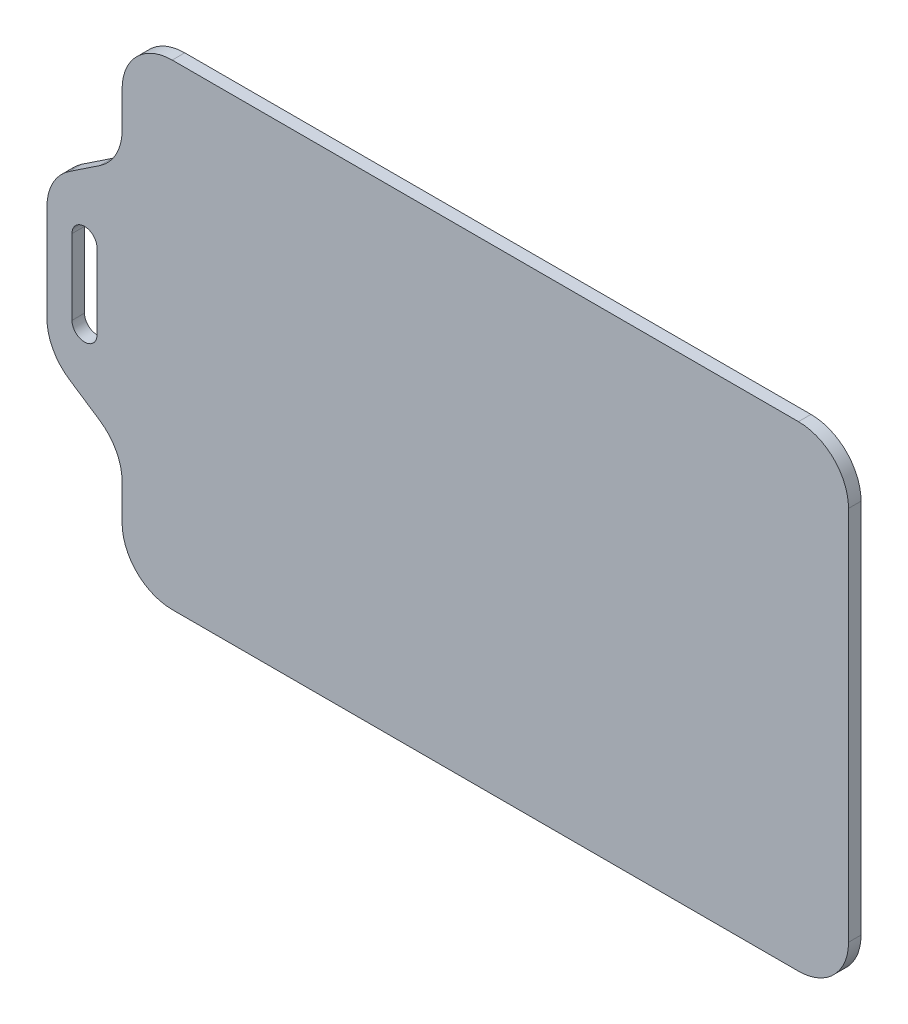
ISO-10303-21;
HEADER;
FILE_DESCRIPTION(('STEP AP214'),'2;1');
FILE_NAME('part.step','',(''),(''),'','','');
FILE_SCHEMA(('AUTOMOTIVE_DESIGN { 1 0 10303 214 1 1 1 1 }'));
ENDSEC;
DATA;
#1=APPLICATION_CONTEXT('core data for automotive mechanical design processes');
#2=APPLICATION_PROTOCOL_DEFINITION('international standard','automotive_design',2000,#1);
#3=PRODUCT_CONTEXT('',#1,'mechanical');
#4=PRODUCT('Part','Part','',(#3));
#5=PRODUCT_RELATED_PRODUCT_CATEGORY('part','',(#4));
#6=PRODUCT_DEFINITION_FORMATION('','',#4);
#7=PRODUCT_DEFINITION_CONTEXT('part definition',#1,'design');
#8=PRODUCT_DEFINITION('design','',#6,#7);
#9=PRODUCT_DEFINITION_SHAPE('','',#8);
#10=(LENGTH_UNIT() NAMED_UNIT(*) SI_UNIT(.MILLI.,.METRE.));
#11=(NAMED_UNIT(*) PLANE_ANGLE_UNIT() SI_UNIT($,.RADIAN.));
#12=(NAMED_UNIT(*) SI_UNIT($,.STERADIAN.) SOLID_ANGLE_UNIT());
#13=UNCERTAINTY_MEASURE_WITH_UNIT(LENGTH_MEASURE(1.E-05),#10,'distance_accuracy_value','');
#14=(GEOMETRIC_REPRESENTATION_CONTEXT(3) GLOBAL_UNCERTAINTY_ASSIGNED_CONTEXT((#13)) GLOBAL_UNIT_ASSIGNED_CONTEXT((#10,
#11,#12)) REPRESENTATION_CONTEXT('',''));
#15=CARTESIAN_POINT('',(0.,0.,0.));
#16=DIRECTION('',(0.,0.,1.));
#17=DIRECTION('',(1.,0.,0.));
#18=AXIS2_PLACEMENT_3D('',#15,#16,#17);
#19=CARTESIAN_POINT('',(-46.0375,4.19649336631483,1.5875));
#20=DIRECTION('',(1.,0.,0.));
#21=DIRECTION('',(0.,1.,0.));
#22=AXIS2_PLACEMENT_3D('',#19,#20,#21);
#23=PLANE('',#22);
#24=DIRECTION('',(0.,-1.,0.));
#25=VECTOR('',#24,1.);
#26=CARTESIAN_POINT('',(-46.0375,4.19649336631483,0.));
#27=LINE('',#26,#25);
#28=CARTESIAN_POINT('',(-46.0375,23.8125,0.));
#29=VERTEX_POINT('',#28);
#30=CARTESIAN_POINT('',(-46.0375,19.2734168663988,0.));
#31=VERTEX_POINT('',#30);
#32=EDGE_CURVE('E283',#29,#31,#27,.T.);
#33=ORIENTED_EDGE('',*,*,#32,.T.);
#34=DIRECTION('',(0.,0.,1.));
#35=VECTOR('',#34,1.);
#36=CARTESIAN_POINT('',(-46.0375,19.2734168663988,1.5875));
#37=LINE('',#36,#35);
#38=CARTESIAN_POINT('',(-46.0375,19.2734168663988,1.5875));
#39=VERTEX_POINT('',#38);
#40=EDGE_CURVE('E397',#31,#39,#37,.T.);
#41=ORIENTED_EDGE('',*,*,#40,.T.);
#42=DIRECTION('',(0.,-1.,0.));
#43=VECTOR('',#42,1.);
#44=CARTESIAN_POINT('',(-46.0375,4.19649336631483,1.5875));
#45=LINE('',#44,#43);
#46=CARTESIAN_POINT('',(-46.0375,23.8125,1.5875));
#47=VERTEX_POINT('',#46);
#48=EDGE_CURVE('E304',#47,#39,#45,.T.);
#49=ORIENTED_EDGE('',*,*,#48,.F.);
#50=DIRECTION('',(0.,0.,-1.));
#51=VECTOR('',#50,1.);
#52=CARTESIAN_POINT('',(-46.0375,23.8125,1.5875));
#53=LINE('',#52,#51);
#54=EDGE_CURVE('E340',#47,#29,#53,.T.);
#55=ORIENTED_EDGE('',*,*,#54,.T.);
#56=EDGE_LOOP('',(#33,#41,#49,#55));
#57=FACE_BOUND('',#56,.T.);
#58=ADVANCED_FACE('F16',(#57),#23,.F.);
#59=CARTESIAN_POINT('',(-46.0375,-19.2734168663988,1.5875));
#60=VERTEX_POINT('',#59);
#61=CARTESIAN_POINT('',(-46.0375,-23.8125,1.5875));
#62=VERTEX_POINT('',#61);
#63=EDGE_CURVE('E303',#60,#62,#45,.T.);
#64=ORIENTED_EDGE('',*,*,#63,.F.);
#65=DIRECTION('',(0.,0.,1.));
#66=VECTOR('',#65,1.);
#67=CARTESIAN_POINT('',(-46.0375,-19.2734168663988,0.));
#68=LINE('',#67,#66);
#69=CARTESIAN_POINT('',(-46.0375,-19.2734168663988,0.));
#70=VERTEX_POINT('',#69);
#71=EDGE_CURVE('E401',#60,#70,#68,.F.);
#72=ORIENTED_EDGE('',*,*,#71,.T.);
#73=CARTESIAN_POINT('',(-46.0375,-23.8125,0.));
#74=VERTEX_POINT('',#73);
#75=EDGE_CURVE('E334',#70,#74,#27,.T.);
#76=ORIENTED_EDGE('',*,*,#75,.T.);
#77=DIRECTION('',(0.,0.,-1.));
#78=VECTOR('',#77,1.);
#79=CARTESIAN_POINT('',(-46.0375,-23.8125,1.5875));
#80=LINE('',#79,#78);
#81=EDGE_CURVE('E308',#62,#74,#80,.T.);
#82=ORIENTED_EDGE('',*,*,#81,.F.);
#83=EDGE_LOOP('',(#64,#72,#76,#82));
#84=FACE_BOUND('',#83,.T.);
#85=ADVANCED_FACE('F419',(#84),#23,.F.);
#86=CARTESIAN_POINT('',(-39.6875,-23.8125,1.5875));
#87=DIRECTION('',(0.,0.,-1.));
#88=DIRECTION('',(-1.,0.,0.));
#89=AXIS2_PLACEMENT_3D('',#86,#87,#88);
#90=CYLINDRICAL_SURFACE('',#89,6.35);
#91=CARTESIAN_POINT('',(-39.6875,-23.8125,0.));
#92=DIRECTION('',(0.,0.,1.));
#93=DIRECTION('',(-1.,0.,0.));
#94=AXIS2_PLACEMENT_3D('',#91,#92,#93);
#95=CIRCLE('',#94,6.35);
#96=CARTESIAN_POINT('',(-39.6875,-30.1625,0.));
#97=VERTEX_POINT('',#96);
#98=EDGE_CURVE('E270',#74,#97,#95,.T.);
#99=ORIENTED_EDGE('',*,*,#98,.T.);
#100=DIRECTION('',(0.,0.,-1.));
#101=VECTOR('',#100,1.);
#102=CARTESIAN_POINT('',(-39.6875,-30.1625,1.5875));
#103=LINE('',#102,#101);
#104=CARTESIAN_POINT('',(-39.6875,-30.1625,1.5875));
#105=VERTEX_POINT('',#104);
#106=EDGE_CURVE('E360',#105,#97,#103,.T.);
#107=ORIENTED_EDGE('',*,*,#106,.F.);
#108=CARTESIAN_POINT('',(-39.6875,-23.8125,1.5875));
#109=DIRECTION('',(0.,0.,1.));
#110=DIRECTION('',(-1.,0.,0.));
#111=AXIS2_PLACEMENT_3D('',#108,#109,#110);
#112=CIRCLE('',#111,6.35);
#113=EDGE_CURVE('E278',#62,#105,#112,.T.);
#114=ORIENTED_EDGE('',*,*,#113,.F.);
#115=ORIENTED_EDGE('',*,*,#81,.T.);
#116=EDGE_LOOP('',(#99,#107,#114,#115));
#117=FACE_BOUND('',#116,.T.);
#118=ADVANCED_FACE('F477',(#117),#90,.T.);
#119=CARTESIAN_POINT('',(-0.0371188492481823,-30.1625,1.5875));
#120=DIRECTION('',(0.,1.,0.));
#121=DIRECTION('',(-1.,0.,0.));
#122=AXIS2_PLACEMENT_3D('',#119,#120,#121);
#123=PLANE('',#122);
#124=DIRECTION('',(1.,0.,0.));
#125=VECTOR('',#124,1.);
#126=CARTESIAN_POINT('',(-0.0371188492481823,-30.1625,0.));
#127=LINE('',#126,#125);
#128=CARTESIAN_POINT('',(39.6875,-30.1625,0.));
#129=VERTEX_POINT('',#128);
#130=EDGE_CURVE('E312',#97,#129,#127,.T.);
#131=ORIENTED_EDGE('',*,*,#130,.T.);
#132=DIRECTION('',(0.,0.,-1.));
#133=VECTOR('',#132,1.);
#134=CARTESIAN_POINT('',(39.6875,-30.1625,1.5875));
#135=LINE('',#134,#133);
#136=CARTESIAN_POINT('',(39.6875,-30.1625,1.5875));
#137=VERTEX_POINT('',#136);
#138=EDGE_CURVE('E356',#137,#129,#135,.T.);
#139=ORIENTED_EDGE('',*,*,#138,.F.);
#140=DIRECTION('',(1.,0.,0.));
#141=VECTOR('',#140,1.);
#142=CARTESIAN_POINT('',(-0.0371188492481823,-30.1625,1.5875));
#143=LINE('',#142,#141);
#144=EDGE_CURVE('E282',#105,#137,#143,.T.);
#145=ORIENTED_EDGE('',*,*,#144,.F.);
#146=ORIENTED_EDGE('',*,*,#106,.T.);
#147=EDGE_LOOP('',(#131,#139,#145,#146));
#148=FACE_BOUND('',#147,.T.);
#149=ADVANCED_FACE('F475',(#148),#123,.F.);
#150=CARTESIAN_POINT('',(39.6875,-23.8125,1.5875));
#151=DIRECTION('',(0.,0.,-1.));
#152=DIRECTION('',(-1.,0.,0.));
#153=AXIS2_PLACEMENT_3D('',#150,#151,#152);
#154=CYLINDRICAL_SURFACE('',#153,6.35);
#155=CARTESIAN_POINT('',(39.6875,-23.8125,0.));
#156=DIRECTION('',(0.,0.,1.));
#157=DIRECTION('',(0.,-1.,0.));
#158=AXIS2_PLACEMENT_3D('',#155,#156,#157);
#159=CIRCLE('',#158,6.35);
#160=CARTESIAN_POINT('',(46.0375,-23.8125,0.));
#161=VERTEX_POINT('',#160);
#162=EDGE_CURVE('E315',#129,#161,#159,.T.);
#163=ORIENTED_EDGE('',*,*,#162,.T.);
#164=DIRECTION('',(0.,0.,-1.));
#165=VECTOR('',#164,1.);
#166=CARTESIAN_POINT('',(46.0375,-23.8125,1.5875));
#167=LINE('',#166,#165);
#168=CARTESIAN_POINT('',(46.0375,-23.8125,1.5875));
#169=VERTEX_POINT('',#168);
#170=EDGE_CURVE('E353',#169,#161,#167,.T.);
#171=ORIENTED_EDGE('',*,*,#170,.F.);
#172=CARTESIAN_POINT('',(39.6875,-23.8125,1.5875));
#173=DIRECTION('',(0.,0.,1.));
#174=DIRECTION('',(0.,-1.,0.));
#175=AXIS2_PLACEMENT_3D('',#172,#173,#174);
#176=CIRCLE('',#175,6.35);
#177=EDGE_CURVE('E286',#137,#169,#176,.T.);
#178=ORIENTED_EDGE('',*,*,#177,.F.);
#179=ORIENTED_EDGE('',*,*,#138,.T.);
#180=EDGE_LOOP('',(#163,#171,#178,#179));
#181=FACE_BOUND('',#180,.T.);
#182=ADVANCED_FACE('F470',(#181),#154,.T.);
#183=CARTESIAN_POINT('',(46.0375,-16.3101635963253,1.5875));
#184=DIRECTION('',(1.,0.,0.));
#185=DIRECTION('',(0.,1.,0.));
#186=AXIS2_PLACEMENT_3D('',#183,#184,#185);
#187=PLANE('',#186);
#188=DIRECTION('',(0.,-1.,0.));
#189=VECTOR('',#188,1.);
#190=CARTESIAN_POINT('',(46.0375,-16.3101635963253,0.));
#191=LINE('',#190,#189);
#192=CARTESIAN_POINT('',(46.0375,23.8125,0.));
#193=VERTEX_POINT('',#192);
#194=EDGE_CURVE('E319',#193,#161,#191,.T.);
#195=ORIENTED_EDGE('',*,*,#194,.F.);
#196=DIRECTION('',(0.,0.,-1.));
#197=VECTOR('',#196,1.);
#198=CARTESIAN_POINT('',(46.0375,23.8125,1.5875));
#199=LINE('',#198,#197);
#200=CARTESIAN_POINT('',(46.0375,23.8125,1.5875));
#201=VERTEX_POINT('',#200);
#202=EDGE_CURVE('E350',#201,#193,#199,.T.);
#203=ORIENTED_EDGE('',*,*,#202,.F.);
#204=DIRECTION('',(0.,-1.,0.));
#205=VECTOR('',#204,1.);
#206=CARTESIAN_POINT('',(46.0375,-16.3101635963253,1.5875));
#207=LINE('',#206,#205);
#208=EDGE_CURVE('E289',#201,#169,#207,.T.);
#209=ORIENTED_EDGE('',*,*,#208,.T.);
#210=ORIENTED_EDGE('',*,*,#170,.T.);
#211=EDGE_LOOP('',(#195,#203,#209,#210));
#212=FACE_BOUND('',#211,.T.);
#213=ADVANCED_FACE('F465',(#212),#187,.T.);
#214=CARTESIAN_POINT('',(39.6875,23.8125,1.5875));
#215=DIRECTION('',(0.,0.,-1.));
#216=DIRECTION('',(-1.,0.,0.));
#217=AXIS2_PLACEMENT_3D('',#214,#215,#216);
#218=CYLINDRICAL_SURFACE('',#217,6.35);
#219=CARTESIAN_POINT('',(39.6875,23.8125,0.));
#220=DIRECTION('',(0.,0.,1.));
#221=DIRECTION('',(1.,0.,0.));
#222=AXIS2_PLACEMENT_3D('',#219,#220,#221);
#223=CIRCLE('',#222,6.35);
#224=CARTESIAN_POINT('',(39.6875,30.1625,0.));
#225=VERTEX_POINT('',#224);
#226=EDGE_CURVE('E323',#193,#225,#223,.T.);
#227=ORIENTED_EDGE('',*,*,#226,.T.);
#228=DIRECTION('',(0.,0.,-1.));
#229=VECTOR('',#228,1.);
#230=CARTESIAN_POINT('',(39.6875,30.1625,1.5875));
#231=LINE('',#230,#229);
#232=CARTESIAN_POINT('',(39.6875,30.1625,1.5875));
#233=VERTEX_POINT('',#232);
#234=EDGE_CURVE('E347',#233,#225,#231,.T.);
#235=ORIENTED_EDGE('',*,*,#234,.F.);
#236=CARTESIAN_POINT('',(39.6875,23.8125,1.5875));
#237=DIRECTION('',(0.,0.,1.));
#238=DIRECTION('',(1.,0.,0.));
#239=AXIS2_PLACEMENT_3D('',#236,#237,#238);
#240=CIRCLE('',#239,6.35);
#241=EDGE_CURVE('E293',#201,#233,#240,.T.);
#242=ORIENTED_EDGE('',*,*,#241,.F.);
#243=ORIENTED_EDGE('',*,*,#202,.T.);
#244=EDGE_LOOP('',(#227,#235,#242,#243));
#245=FACE_BOUND('',#244,.T.);
#246=ADVANCED_FACE('F461',(#245),#218,.T.);
#247=CARTESIAN_POINT('',(0.,30.1625,1.5875));
#248=DIRECTION('',(0.,1.,0.));
#249=DIRECTION('',(-1.,0.,0.));
#250=AXIS2_PLACEMENT_3D('',#247,#248,#249);
#251=PLANE('',#250);
#252=DIRECTION('',(1.,0.,0.));
#253=VECTOR('',#252,1.);
#254=CARTESIAN_POINT('',(0.,30.1625,0.));
#255=LINE('',#254,#253);
#256=CARTESIAN_POINT('',(-39.6875,30.1625,0.));
#257=VERTEX_POINT('',#256);
#258=EDGE_CURVE('E327',#257,#225,#255,.T.);
#259=ORIENTED_EDGE('',*,*,#258,.F.);
#260=DIRECTION('',(0.,0.,-1.));
#261=VECTOR('',#260,1.);
#262=CARTESIAN_POINT('',(-39.6875,30.1625,1.5875));
#263=LINE('',#262,#261);
#264=CARTESIAN_POINT('',(-39.6875,30.1625,1.5875));
#265=VERTEX_POINT('',#264);
#266=EDGE_CURVE('E344',#265,#257,#263,.T.);
#267=ORIENTED_EDGE('',*,*,#266,.F.);
#268=DIRECTION('',(1.,0.,0.));
#269=VECTOR('',#268,1.);
#270=CARTESIAN_POINT('',(0.,30.1625,1.5875));
#271=LINE('',#270,#269);
#272=EDGE_CURVE('E296',#265,#233,#271,.T.);
#273=ORIENTED_EDGE('',*,*,#272,.T.);
#274=ORIENTED_EDGE('',*,*,#234,.T.);
#275=EDGE_LOOP('',(#259,#267,#273,#274));
#276=FACE_BOUND('',#275,.T.);
#277=ADVANCED_FACE('F457',(#276),#251,.T.);
#278=CARTESIAN_POINT('',(-39.6875,23.8125,1.5875));
#279=DIRECTION('',(0.,0.,-1.));
#280=DIRECTION('',(-1.,0.,0.));
#281=AXIS2_PLACEMENT_3D('',#278,#279,#280);
#282=CYLINDRICAL_SURFACE('',#281,6.35);
#283=CARTESIAN_POINT('',(-39.6875,23.8125,0.));
#284=DIRECTION('',(0.,0.,1.));
#285=DIRECTION('',(0.,1.,0.));
#286=AXIS2_PLACEMENT_3D('',#283,#284,#285);
#287=CIRCLE('',#286,6.35);
#288=EDGE_CURVE('E331',#257,#29,#287,.T.);
#289=ORIENTED_EDGE('',*,*,#288,.T.);
#290=ORIENTED_EDGE('',*,*,#54,.F.);
#291=CARTESIAN_POINT('',(-39.6875,23.8125,1.5875));
#292=DIRECTION('',(0.,0.,1.));
#293=DIRECTION('',(0.,1.,0.));
#294=AXIS2_PLACEMENT_3D('',#291,#292,#293);
#295=CIRCLE('',#294,6.35);
#296=EDGE_CURVE('E300',#265,#47,#295,.T.);
#297=ORIENTED_EDGE('',*,*,#296,.F.);
#298=ORIENTED_EDGE('',*,*,#266,.T.);
#299=EDGE_LOOP('',(#289,#290,#297,#298));
#300=FACE_BOUND('',#299,.T.);
#301=ADVANCED_FACE('F452',(#300),#282,.T.);
#302=CARTESIAN_POINT('',(0.,0.,1.5875));
#303=DIRECTION('',(0.,0.,1.));
#304=DIRECTION('',(1.,0.,0.));
#305=AXIS2_PLACEMENT_3D('',#302,#303,#304);
#306=PLANE('',#305);
#307=DIRECTION('',(0.832050294337843,0.55470019622523,0.));
#308=VECTOR('',#307,1.);
#309=CARTESIAN_POINT('',(-47.0427033282168,15.2048644478555,1.5875));
#310=LINE('',#309,#308);
#311=CARTESIAN_POINT('',(-52.7348462460302,11.4101025026465,1.5875));
#312=VERTEX_POINT('',#311);
#313=CARTESIAN_POINT('',(-48.8651537539698,13.9898974973535,1.5875));
#314=VERTEX_POINT('',#313);
#315=EDGE_CURVE('E235',#312,#314,#310,.T.);
#316=ORIENTED_EDGE('',*,*,#315,.F.);
#317=CARTESIAN_POINT('',(-49.2125,6.12658313360122,1.58750000002783));
#318=DIRECTION('',(0.,0.,1.));
#319=DIRECTION('',(1.,0.,0.));
#320=AXIS2_PLACEMENT_3D('',#317,#318,#319);
#321=CIRCLE('',#320,6.35);
#322=CARTESIAN_POINT('',(-55.5625,6.12658313360122,1.5875));
#323=VERTEX_POINT('',#322);
#324=EDGE_CURVE('E374',#312,#323,#321,.T.);
#325=ORIENTED_EDGE('',*,*,#324,.T.);
#326=DIRECTION('',(0.,1.,0.));
#327=VECTOR('',#326,1.);
#328=CARTESIAN_POINT('',(-55.5625,-2.68836738541722,1.5875));
#329=LINE('',#328,#327);
#330=CARTESIAN_POINT('',(-55.5625,-6.12658313360123,1.5875));
#331=VERTEX_POINT('',#330);
#332=EDGE_CURVE('E239',#331,#323,#329,.T.);
#333=ORIENTED_EDGE('',*,*,#332,.F.);
#334=CARTESIAN_POINT('',(-49.2125,-6.12658313360123,1.58750000002783));
#335=DIRECTION('',(0.,0.,1.));
#336=DIRECTION('',(1.,0.,0.));
#337=AXIS2_PLACEMENT_3D('',#334,#335,#336);
#338=CIRCLE('',#337,6.35);
#339=CARTESIAN_POINT('',(-52.7348462460302,-11.4101025026465,1.5875));
#340=VERTEX_POINT('',#339);
#341=EDGE_CURVE('E371',#331,#340,#338,.T.);
#342=ORIENTED_EDGE('',*,*,#341,.T.);
#343=DIRECTION('',(-0.832050294337843,0.55470019622523,0.));
#344=VECTOR('',#343,1.);
#345=CARTESIAN_POINT('',(-48.4408763400648,-14.2727491066235,1.5875));
#346=LINE('',#345,#344);
#347=CARTESIAN_POINT('',(-48.8651537539698,-13.9898974973535,1.5875));
#348=VERTEX_POINT('',#347);
#349=EDGE_CURVE('E243',#348,#340,#346,.T.);
#350=ORIENTED_EDGE('',*,*,#349,.F.);
#351=CARTESIAN_POINT('',(-52.3875,-19.2734168663988,1.58750000002783));
#352=DIRECTION('',(0.,0.,1.));
#353=DIRECTION('',(1.,0.,0.));
#354=AXIS2_PLACEMENT_3D('',#351,#352,#353);
#355=CIRCLE('',#354,6.35);
#356=EDGE_CURVE('E25',#348,#60,#355,.F.);
#357=ORIENTED_EDGE('',*,*,#356,.T.);
#358=ORIENTED_EDGE('',*,*,#63,.T.);
#359=ORIENTED_EDGE('',*,*,#113,.T.);
#360=ORIENTED_EDGE('',*,*,#144,.T.);
#361=ORIENTED_EDGE('',*,*,#177,.T.);
#362=ORIENTED_EDGE('',*,*,#208,.F.);
#363=ORIENTED_EDGE('',*,*,#241,.T.);
#364=ORIENTED_EDGE('',*,*,#272,.F.);
#365=ORIENTED_EDGE('',*,*,#296,.T.);
#366=ORIENTED_EDGE('',*,*,#48,.T.);
#367=CARTESIAN_POINT('',(-52.3875,19.2734168663988,1.5875));
#368=DIRECTION('',(0.,0.,1.));
#369=DIRECTION('',(1.,0.,0.));
#370=AXIS2_PLACEMENT_3D('',#367,#368,#369);
#371=CIRCLE('',#370,6.35);
#372=EDGE_CURVE('E404',#39,#314,#371,.F.);
#373=ORIENTED_EDGE('',*,*,#372,.T.);
#374=EDGE_LOOP('',(#316,#325,#333,#342,#350,#357,#358,#359,#360,#361,#362,#363,#364,#365,#366,#373));
#375=FACE_BOUND('',#374,.T.);
#376=DIRECTION('',(0.,1.,0.));
#377=VECTOR('',#376,1.);
#378=CARTESIAN_POINT('',(-49.2125,0.296247742222316,1.5875));
#379=LINE('',#378,#377);
#380=CARTESIAN_POINT('',(-49.2125000000013,-4.76250102678794,1.5875));
#381=VERTEX_POINT('',#380);
#382=CARTESIAN_POINT('',(-49.2125,4.76249897321206,1.5875));
#383=VERTEX_POINT('',#382);
#384=EDGE_CURVE('E204',#381,#383,#379,.T.);
#385=ORIENTED_EDGE('',*,*,#384,.F.);
#386=CARTESIAN_POINT('',(-50.8000000000013,-4.76250102678794,1.5875));
#387=DIRECTION('',(0.,0.,1.));
#388=DIRECTION('',(-0.999999999999163,1.29359109546193E-06,0.));
#389=AXIS2_PLACEMENT_3D('',#386,#387,#388);
#390=CIRCLE('',#389,1.5875);
#391=CARTESIAN_POINT('',(-52.3875,-4.76249897321207,1.5875));
#392=VERTEX_POINT('',#391);
#393=EDGE_CURVE('E213',#392,#381,#390,.T.);
#394=ORIENTED_EDGE('',*,*,#393,.F.);
#395=DIRECTION('',(0.,1.,0.));
#396=VECTOR('',#395,1.);
#397=CARTESIAN_POINT('',(-52.3875,0.297002166187585,1.5875));
#398=LINE('',#397,#396);
#399=CARTESIAN_POINT('',(-52.3875,4.76249897321206,1.5875));
#400=VERTEX_POINT('',#399);
#401=EDGE_CURVE('E220',#392,#400,#398,.T.);
#402=ORIENTED_EDGE('',*,*,#401,.T.);
#403=CARTESIAN_POINT('',(-50.8,4.76249897321206,1.5875));
#404=DIRECTION('',(0.,0.,-1.));
#405=DIRECTION('',(-1.,0.,0.));
#406=AXIS2_PLACEMENT_3D('',#403,#404,#405);
#407=CIRCLE('',#406,1.5875);
#408=EDGE_CURVE('E225',#400,#383,#407,.T.);
#409=ORIENTED_EDGE('',*,*,#408,.T.);
#410=EDGE_LOOP('',(#385,#394,#402,#409));
#411=FACE_BOUND('',#410,.T.);
#412=ADVANCED_FACE('F223',(#375,#411),#306,.T.);
#413=CARTESIAN_POINT('',(0.,0.,0.));
#414=DIRECTION('',(0.,0.,1.));
#415=DIRECTION('',(1.,0.,0.));
#416=AXIS2_PLACEMENT_3D('',#413,#414,#415);
#417=PLANE('',#416);
#418=DIRECTION('',(0.,-1.,0.));
#419=VECTOR('',#418,1.);
#420=CARTESIAN_POINT('',(-55.5625,-2.68836738541722,0.));
#421=LINE('',#420,#419);
#422=CARTESIAN_POINT('',(-55.5625,6.12658313360122,0.));
#423=VERTEX_POINT('',#422);
#424=CARTESIAN_POINT('',(-55.5625,-6.12658313360123,0.));
#425=VERTEX_POINT('',#424);
#426=EDGE_CURVE('E257',#423,#425,#421,.T.);
#427=ORIENTED_EDGE('',*,*,#426,.F.);
#428=CARTESIAN_POINT('',(-49.2125,6.12658313360122,0.));
#429=DIRECTION('',(0.,0.,1.));
#430=DIRECTION('',(1.,0.,0.));
#431=AXIS2_PLACEMENT_3D('',#428,#429,#430);
#432=CIRCLE('',#431,6.35);
#433=CARTESIAN_POINT('',(-52.7348462460302,11.4101025026465,0.));
#434=VERTEX_POINT('',#433);
#435=EDGE_CURVE('E387',#423,#434,#432,.F.);
#436=ORIENTED_EDGE('',*,*,#435,.T.);
#437=DIRECTION('',(-0.832050294337843,-0.55470019622523,0.));
#438=VECTOR('',#437,1.);
#439=CARTESIAN_POINT('',(-47.0427033282168,15.2048644478555,0.));
#440=LINE('',#439,#438);
#441=CARTESIAN_POINT('',(-48.8651537539698,13.9898974973535,0.));
#442=VERTEX_POINT('',#441);
#443=EDGE_CURVE('E261',#442,#434,#440,.T.);
#444=ORIENTED_EDGE('',*,*,#443,.F.);
#445=CARTESIAN_POINT('',(-52.3875,19.2734168663988,0.));
#446=DIRECTION('',(0.,0.,1.));
#447=DIRECTION('',(1.,0.,0.));
#448=AXIS2_PLACEMENT_3D('',#445,#446,#447);
#449=CIRCLE('',#448,6.35);
#450=EDGE_CURVE('E37',#442,#31,#449,.T.);
#451=ORIENTED_EDGE('',*,*,#450,.T.);
#452=ORIENTED_EDGE('',*,*,#32,.F.);
#453=ORIENTED_EDGE('',*,*,#288,.F.);
#454=ORIENTED_EDGE('',*,*,#258,.T.);
#455=ORIENTED_EDGE('',*,*,#226,.F.);
#456=ORIENTED_EDGE('',*,*,#194,.T.);
#457=ORIENTED_EDGE('',*,*,#162,.F.);
#458=ORIENTED_EDGE('',*,*,#130,.F.);
#459=ORIENTED_EDGE('',*,*,#98,.F.);
#460=ORIENTED_EDGE('',*,*,#75,.F.);
#461=CARTESIAN_POINT('',(-52.3875,-19.2734168663988,0.));
#462=DIRECTION('',(0.,0.,1.));
#463=DIRECTION('',(1.,0.,0.));
#464=AXIS2_PLACEMENT_3D('',#461,#462,#463);
#465=CIRCLE('',#464,6.35);
#466=CARTESIAN_POINT('',(-48.8651537539698,-13.9898974973535,0.));
#467=VERTEX_POINT('',#466);
#468=EDGE_CURVE('E10',#70,#467,#465,.T.);
#469=ORIENTED_EDGE('',*,*,#468,.T.);
#470=DIRECTION('',(0.832050294337843,-0.55470019622523,0.));
#471=VECTOR('',#470,1.);
#472=CARTESIAN_POINT('',(-48.4408763400648,-14.2727491066235,0.));
#473=LINE('',#472,#471);
#474=CARTESIAN_POINT('',(-52.7348462460302,-11.4101025026465,0.));
#475=VERTEX_POINT('',#474);
#476=EDGE_CURVE('E254',#475,#467,#473,.T.);
#477=ORIENTED_EDGE('',*,*,#476,.F.);
#478=CARTESIAN_POINT('',(-49.2125,-6.12658313360123,0.));
#479=DIRECTION('',(0.,0.,1.));
#480=DIRECTION('',(1.,0.,0.));
#481=AXIS2_PLACEMENT_3D('',#478,#479,#480);
#482=CIRCLE('',#481,6.35);
#483=EDGE_CURVE('E384',#475,#425,#482,.F.);
#484=ORIENTED_EDGE('',*,*,#483,.T.);
#485=EDGE_LOOP('',(#427,#436,#444,#451,#452,#453,#454,#455,#456,#457,#458,#459,#460,#469,#477,#484));
#486=FACE_BOUND('',#485,.T.);
#487=CARTESIAN_POINT('',(-50.8,4.76249897321206,0.));
#488=DIRECTION('',(0.,0.,1.));
#489=DIRECTION('',(1.,0.,0.));
#490=AXIS2_PLACEMENT_3D('',#487,#488,#489);
#491=CIRCLE('',#490,1.5875);
#492=CARTESIAN_POINT('',(-49.2125,4.76249897321206,0.));
#493=VERTEX_POINT('',#492);
#494=CARTESIAN_POINT('',(-52.3875,4.76249897321206,0.));
#495=VERTEX_POINT('',#494);
#496=EDGE_CURVE('E266',#493,#495,#491,.T.);
#497=ORIENTED_EDGE('',*,*,#496,.T.);
#498=DIRECTION('',(0.,-1.,0.));
#499=VECTOR('',#498,1.);
#500=CARTESIAN_POINT('',(-52.3875,0.297002166187585,0.));
#501=LINE('',#500,#499);
#502=CARTESIAN_POINT('',(-52.3875,-4.76249897321207,0.));
#503=VERTEX_POINT('',#502);
#504=EDGE_CURVE('E265',#495,#503,#501,.T.);
#505=ORIENTED_EDGE('',*,*,#504,.T.);
#506=CARTESIAN_POINT('',(-50.8000000000013,-4.76250102678794,0.));
#507=DIRECTION('',(0.,0.,1.));
#508=DIRECTION('',(1.,0.,0.));
#509=AXIS2_PLACEMENT_3D('',#506,#507,#508);
#510=CIRCLE('',#509,1.5875);
#511=CARTESIAN_POINT('',(-49.2125000000013,-4.76250102678794,0.));
#512=VERTEX_POINT('',#511);
#513=EDGE_CURVE('E209',#512,#503,#510,.F.);
#514=ORIENTED_EDGE('',*,*,#513,.F.);
#515=DIRECTION('',(0.,-1.,0.));
#516=VECTOR('',#515,1.);
#517=CARTESIAN_POINT('',(-49.2125,0.296247742222316,0.));
#518=LINE('',#517,#516);
#519=EDGE_CURVE('E205',#493,#512,#518,.T.);
#520=ORIENTED_EDGE('',*,*,#519,.F.);
#521=EDGE_LOOP('',(#497,#505,#514,#520));
#522=FACE_BOUND('',#521,.T.);
#523=ADVANCED_FACE('F427',(#486,#522),#417,.F.);
#524=CARTESIAN_POINT('',(-55.5625,-2.68836738541722,-500000.));
#525=DIRECTION('',(1.,0.,0.));
#526=DIRECTION('',(0.,1.,0.));
#527=AXIS2_PLACEMENT_3D('',#524,#525,#526);
#528=PLANE('',#527);
#529=ORIENTED_EDGE('',*,*,#332,.T.);
#530=DIRECTION('',(0.,0.,1.));
#531=VECTOR('',#530,1.);
#532=CARTESIAN_POINT('',(-55.5625,6.12658313360122,-500000.));
#533=LINE('',#532,#531);
#534=EDGE_CURVE('E381',#323,#423,#533,.F.);
#535=ORIENTED_EDGE('',*,*,#534,.T.);
#536=ORIENTED_EDGE('',*,*,#426,.T.);
#537=DIRECTION('',(0.,0.,1.));
#538=VECTOR('',#537,1.);
#539=CARTESIAN_POINT('',(-55.5625,-6.12658313360123,-500000.));
#540=LINE('',#539,#538);
#541=EDGE_CURVE('E377',#425,#331,#540,.T.);
#542=ORIENTED_EDGE('',*,*,#541,.T.);
#543=EDGE_LOOP('',(#529,#535,#536,#542));
#544=FACE_BOUND('',#543,.T.);
#545=ADVANCED_FACE('F434',(#544),#528,.F.);
#546=CARTESIAN_POINT('',(-50.8000000000013,-4.76250102678794,-500000.));
#547=DIRECTION('',(0.,0.,1.));
#548=DIRECTION('',(1.,0.,0.));
#549=AXIS2_PLACEMENT_3D('',#546,#547,#548);
#550=CYLINDRICAL_SURFACE('',#549,1.5875);
#551=DIRECTION('',(0.,0.,1.));
#552=VECTOR('',#551,1.);
#553=CARTESIAN_POINT('',(-49.2125000000013,-4.76250102678794,-500000.));
#554=LINE('',#553,#552);
#555=EDGE_CURVE('E199',#512,#381,#554,.T.);
#556=ORIENTED_EDGE('',*,*,#555,.F.);
#557=ORIENTED_EDGE('',*,*,#513,.T.);
#558=DIRECTION('',(0.,0.,1.));
#559=VECTOR('',#558,1.);
#560=CARTESIAN_POINT('',(-52.3875,-4.76249897321207,-500000.));
#561=LINE('',#560,#559);
#562=EDGE_CURVE('E210',#503,#392,#561,.T.);
#563=ORIENTED_EDGE('',*,*,#562,.T.);
#564=ORIENTED_EDGE('',*,*,#393,.T.);
#565=EDGE_LOOP('',(#556,#557,#563,#564));
#566=FACE_BOUND('',#565,.T.);
#567=ADVANCED_FACE('F214',(#566),#550,.F.);
#568=CARTESIAN_POINT('',(-52.3875,0.297002166187585,-500000.));
#569=DIRECTION('',(1.,0.,0.));
#570=DIRECTION('',(0.,0.,-1.));
#571=AXIS2_PLACEMENT_3D('',#568,#569,#570);
#572=PLANE('',#571);
#573=ORIENTED_EDGE('',*,*,#504,.F.);
#574=DIRECTION('',(0.,0.,1.));
#575=VECTOR('',#574,1.);
#576=CARTESIAN_POINT('',(-52.3875,4.76249897321206,-500000.));
#577=LINE('',#576,#575);
#578=EDGE_CURVE('E249',#495,#400,#577,.T.);
#579=ORIENTED_EDGE('',*,*,#578,.T.);
#580=ORIENTED_EDGE('',*,*,#401,.F.);
#581=ORIENTED_EDGE('',*,*,#562,.F.);
#582=EDGE_LOOP('',(#573,#579,#580,#581));
#583=FACE_BOUND('',#582,.T.);
#584=ADVANCED_FACE('F541',(#583),#572,.T.);
#585=CARTESIAN_POINT('',(-47.0427033282168,15.2048644478555,-500000.));
#586=DIRECTION('',(0.55470019622523,-0.832050294337843,0.));
#587=DIRECTION('',(0.832050294337843,0.55470019622523,0.));
#588=AXIS2_PLACEMENT_3D('',#585,#586,#587);
#589=PLANE('',#588);
#590=ORIENTED_EDGE('',*,*,#443,.T.);
#591=DIRECTION('',(0.,0.,1.));
#592=VECTOR('',#591,1.);
#593=CARTESIAN_POINT('',(-52.7348462460302,11.4101025026465,-500000.));
#594=LINE('',#593,#592);
#595=EDGE_CURVE('E367',#434,#312,#594,.T.);
#596=ORIENTED_EDGE('',*,*,#595,.T.);
#597=ORIENTED_EDGE('',*,*,#315,.T.);
#598=DIRECTION('',(0.,0.,1.));
#599=VECTOR('',#598,1.);
#600=CARTESIAN_POINT('',(-48.8651537539698,13.9898974973535,0.));
#601=LINE('',#600,#599);
#602=EDGE_CURVE('E364',#314,#442,#601,.F.);
#603=ORIENTED_EDGE('',*,*,#602,.T.);
#604=EDGE_LOOP('',(#590,#596,#597,#603));
#605=FACE_BOUND('',#604,.T.);
#606=ADVANCED_FACE('F441',(#605),#589,.F.);
#607=CARTESIAN_POINT('',(-48.4408763400648,-14.2727491066235,-500000.));
#608=DIRECTION('',(0.55470019622523,0.832050294337843,0.));
#609=DIRECTION('',(-0.832050294337843,0.55470019622523,0.));
#610=AXIS2_PLACEMENT_3D('',#607,#608,#609);
#611=PLANE('',#610);
#612=ORIENTED_EDGE('',*,*,#349,.T.);
#613=DIRECTION('',(0.,0.,1.));
#614=VECTOR('',#613,1.);
#615=CARTESIAN_POINT('',(-52.7348462460302,-11.4101025026465,-500000.));
#616=LINE('',#615,#614);
#617=EDGE_CURVE('E394',#340,#475,#616,.F.);
#618=ORIENTED_EDGE('',*,*,#617,.T.);
#619=ORIENTED_EDGE('',*,*,#476,.T.);
#620=DIRECTION('',(0.,0.,1.));
#621=VECTOR('',#620,1.);
#622=CARTESIAN_POINT('',(-48.8651537539698,-13.9898974973535,1.58750000002783));
#623=LINE('',#622,#621);
#624=EDGE_CURVE('E390',#467,#348,#623,.T.);
#625=ORIENTED_EDGE('',*,*,#624,.T.);
#626=EDGE_LOOP('',(#612,#618,#619,#625));
#627=FACE_BOUND('',#626,.T.);
#628=ADVANCED_FACE('F423',(#627),#611,.F.);
#629=CARTESIAN_POINT('',(-49.2125,0.296247742222316,-500000.));
#630=DIRECTION('',(1.,0.,0.));
#631=DIRECTION('',(0.,0.,-1.));
#632=AXIS2_PLACEMENT_3D('',#629,#630,#631);
#633=PLANE('',#632);
#634=DIRECTION('',(0.,0.,1.));
#635=VECTOR('',#634,1.);
#636=CARTESIAN_POINT('',(-49.2125,4.76249897321206,-500000.));
#637=LINE('',#636,#635);
#638=EDGE_CURVE('E247',#493,#383,#637,.T.);
#639=ORIENTED_EDGE('',*,*,#638,.F.);
#640=ORIENTED_EDGE('',*,*,#519,.T.);
#641=ORIENTED_EDGE('',*,*,#555,.T.);
#642=ORIENTED_EDGE('',*,*,#384,.T.);
#643=EDGE_LOOP('',(#639,#640,#641,#642));
#644=FACE_BOUND('',#643,.T.);
#645=ADVANCED_FACE('F202',(#644),#633,.F.);
#646=CARTESIAN_POINT('',(-50.8,4.76249897321206,-500000.));
#647=DIRECTION('',(0.,0.,1.));
#648=DIRECTION('',(1.,0.,0.));
#649=AXIS2_PLACEMENT_3D('',#646,#647,#648);
#650=CYLINDRICAL_SURFACE('',#649,1.5875);
#651=ORIENTED_EDGE('',*,*,#496,.F.);
#652=ORIENTED_EDGE('',*,*,#638,.T.);
#653=ORIENTED_EDGE('',*,*,#408,.F.);
#654=ORIENTED_EDGE('',*,*,#578,.F.);
#655=EDGE_LOOP('',(#651,#652,#653,#654));
#656=FACE_BOUND('',#655,.T.);
#657=ADVANCED_FACE('F529',(#656),#650,.F.);
#658=CARTESIAN_POINT('',(-49.2125,6.12658313360122,-500000.));
#659=DIRECTION('',(0.,0.,1.));
#660=DIRECTION('',(1.,0.,0.));
#661=AXIS2_PLACEMENT_3D('',#658,#659,#660);
#662=CYLINDRICAL_SURFACE('',#661,6.35);
#663=ORIENTED_EDGE('',*,*,#435,.F.);
#664=ORIENTED_EDGE('',*,*,#534,.F.);
#665=ORIENTED_EDGE('',*,*,#324,.F.);
#666=ORIENTED_EDGE('',*,*,#595,.F.);
#667=EDGE_LOOP('',(#663,#664,#665,#666));
#668=FACE_BOUND('',#667,.T.);
#669=ADVANCED_FACE('F439',(#668),#662,.T.);
#670=CARTESIAN_POINT('',(-49.2125,-6.12658313360123,-500000.));
#671=DIRECTION('',(0.,0.,1.));
#672=DIRECTION('',(1.,0.,0.));
#673=AXIS2_PLACEMENT_3D('',#670,#671,#672);
#674=CYLINDRICAL_SURFACE('',#673,6.35);
#675=ORIENTED_EDGE('',*,*,#483,.F.);
#676=ORIENTED_EDGE('',*,*,#617,.F.);
#677=ORIENTED_EDGE('',*,*,#341,.F.);
#678=ORIENTED_EDGE('',*,*,#541,.F.);
#679=EDGE_LOOP('',(#675,#676,#677,#678));
#680=FACE_BOUND('',#679,.T.);
#681=ADVANCED_FACE('F431',(#680),#674,.T.);
#682=CARTESIAN_POINT('',(-52.3875,19.2734168663988,1.5875));
#683=DIRECTION('',(0.,0.,-1.));
#684=DIRECTION('',(-1.,0.,0.));
#685=AXIS2_PLACEMENT_3D('',#682,#683,#684);
#686=CYLINDRICAL_SURFACE('',#685,6.35);
#687=ORIENTED_EDGE('',*,*,#450,.F.);
#688=ORIENTED_EDGE('',*,*,#602,.F.);
#689=ORIENTED_EDGE('',*,*,#372,.F.);
#690=ORIENTED_EDGE('',*,*,#40,.F.);
#691=EDGE_LOOP('',(#687,#688,#689,#690));
#692=FACE_BOUND('',#691,.T.);
#693=ADVANCED_FACE('F445',(#692),#686,.F.);
#694=CARTESIAN_POINT('',(-52.3875,-19.2734168663988,-500000.));
#695=DIRECTION('',(0.,0.,-1.));
#696=DIRECTION('',(-1.,0.,0.));
#697=AXIS2_PLACEMENT_3D('',#694,#695,#696);
#698=CYLINDRICAL_SURFACE('',#697,6.35);
#699=ORIENTED_EDGE('',*,*,#468,.F.);
#700=ORIENTED_EDGE('',*,*,#71,.F.);
#701=ORIENTED_EDGE('',*,*,#356,.F.);
#702=ORIENTED_EDGE('',*,*,#624,.F.);
#703=EDGE_LOOP('',(#699,#700,#701,#702));
#704=FACE_BOUND('',#703,.T.);
#705=ADVANCED_FACE('F18',(#704),#698,.F.);
#706=CLOSED_SHELL('',(#58,#85,#118,#149,#182,#213,#246,#277,#301,#412,#523,#545,#567,#584,#606,
#628,#645,#657,#669,#681,#693,#705));
#707=MANIFOLD_SOLID_BREP('B1',#706);
#708=ADVANCED_BREP_SHAPE_REPRESENTATION('',(#18,#707),#14);
#709=SHAPE_DEFINITION_REPRESENTATION(#9,#708);
ENDSEC;
END-ISO-10303-21;
